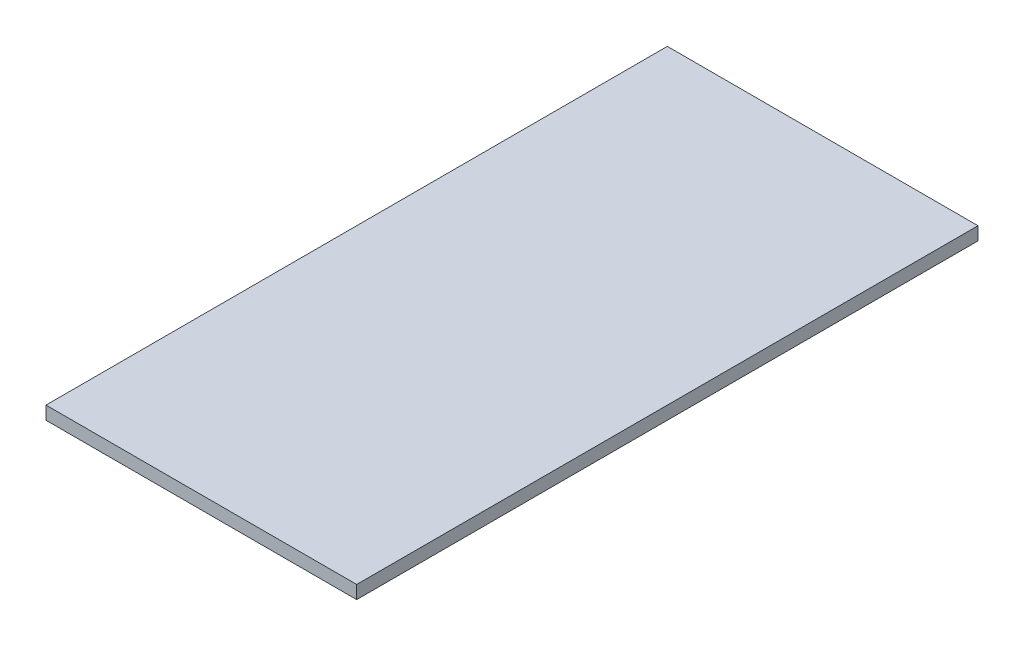
ISO-10303-21;
HEADER;
FILE_DESCRIPTION(('STEP AP214'),'2;1');
FILE_NAME('part.step','',(''),(''),'','','');
FILE_SCHEMA(('AUTOMOTIVE_DESIGN { 1 0 10303 214 1 1 1 1 }'));
ENDSEC;
DATA;
#1=APPLICATION_CONTEXT('core data for automotive mechanical design processes');
#2=APPLICATION_PROTOCOL_DEFINITION('international standard','automotive_design',2000,#1);
#3=PRODUCT_CONTEXT('',#1,'mechanical');
#4=PRODUCT('Part','Part','',(#3));
#5=PRODUCT_RELATED_PRODUCT_CATEGORY('part','',(#4));
#6=PRODUCT_DEFINITION_FORMATION('','',#4);
#7=PRODUCT_DEFINITION_CONTEXT('part definition',#1,'design');
#8=PRODUCT_DEFINITION('design','',#6,#7);
#9=PRODUCT_DEFINITION_SHAPE('','',#8);
#10=(LENGTH_UNIT() NAMED_UNIT(*) SI_UNIT(.MILLI.,.METRE.));
#11=(NAMED_UNIT(*) PLANE_ANGLE_UNIT() SI_UNIT($,.RADIAN.));
#12=(NAMED_UNIT(*) SI_UNIT($,.STERADIAN.) SOLID_ANGLE_UNIT());
#13=UNCERTAINTY_MEASURE_WITH_UNIT(LENGTH_MEASURE(1.E-05),#10,'distance_accuracy_value','');
#14=(GEOMETRIC_REPRESENTATION_CONTEXT(3) GLOBAL_UNCERTAINTY_ASSIGNED_CONTEXT((#13)) GLOBAL_UNIT_ASSIGNED_CONTEXT((#10,
#11,#12)) REPRESENTATION_CONTEXT('',''));
#15=CARTESIAN_POINT('',(0.,0.,0.));
#16=DIRECTION('',(0.,0.,1.));
#17=DIRECTION('',(1.,0.,0.));
#18=AXIS2_PLACEMENT_3D('',#15,#16,#17);
#19=CARTESIAN_POINT('',(74.9999999999999,6.35,150.));
#20=DIRECTION('',(-1.,0.,0.));
#21=DIRECTION('',(0.,0.,1.));
#22=AXIS2_PLACEMENT_3D('',#19,#20,#21);
#23=PLANE('',#22);
#24=DIRECTION('',(0.,0.,-1.));
#25=VECTOR('',#24,1.);
#26=CARTESIAN_POINT('',(74.9999999999999,0.,150.));
#27=LINE('',#26,#25);
#28=CARTESIAN_POINT('',(74.9999999999999,0.,150.));
#29=VERTEX_POINT('',#28);
#30=CARTESIAN_POINT('',(74.9999999999999,0.,-150.));
#31=VERTEX_POINT('',#30);
#32=EDGE_CURVE('E102',#29,#31,#27,.T.);
#33=ORIENTED_EDGE('',*,*,#32,.T.);
#34=DIRECTION('',(0.,-1.,0.));
#35=VECTOR('',#34,1.);
#36=CARTESIAN_POINT('',(74.9999999999999,6.35,-150.));
#37=LINE('',#36,#35);
#38=CARTESIAN_POINT('',(74.9999999999999,6.35,-150.));
#39=VERTEX_POINT('',#38);
#40=EDGE_CURVE('E11',#39,#31,#37,.T.);
#41=ORIENTED_EDGE('',*,*,#40,.F.);
#42=DIRECTION('',(0.,0.,-1.));
#43=VECTOR('',#42,1.);
#44=CARTESIAN_POINT('',(74.9999999999999,6.35,150.));
#45=LINE('',#44,#43);
#46=CARTESIAN_POINT('',(74.9999999999999,6.35,150.));
#47=VERTEX_POINT('',#46);
#48=EDGE_CURVE('E90',#47,#39,#45,.T.);
#49=ORIENTED_EDGE('',*,*,#48,.F.);
#50=DIRECTION('',(0.,-1.,0.));
#51=VECTOR('',#50,1.);
#52=CARTESIAN_POINT('',(74.9999999999999,6.35,150.));
#53=LINE('',#52,#51);
#54=EDGE_CURVE('E98',#47,#29,#53,.T.);
#55=ORIENTED_EDGE('',*,*,#54,.T.);
#56=EDGE_LOOP('',(#33,#41,#49,#55));
#57=FACE_BOUND('',#56,.T.);
#58=ADVANCED_FACE('F39',(#57),#23,.F.);
#59=CARTESIAN_POINT('',(-75.0000000000001,6.35,-150.));
#60=DIRECTION('',(0.,0.,1.));
#61=DIRECTION('',(1.,0.,0.));
#62=AXIS2_PLACEMENT_3D('',#59,#60,#61);
#63=PLANE('',#62);
#64=DIRECTION('',(-1.,0.,0.));
#65=VECTOR('',#64,1.);
#66=CARTESIAN_POINT('',(-75.0000000000001,0.,-150.));
#67=LINE('',#66,#65);
#68=CARTESIAN_POINT('',(-75.0000000000001,0.,-150.));
#69=VERTEX_POINT('',#68);
#70=EDGE_CURVE('E94',#31,#69,#67,.T.);
#71=ORIENTED_EDGE('',*,*,#70,.T.);
#72=DIRECTION('',(0.,-1.,0.));
#73=VECTOR('',#72,1.);
#74=CARTESIAN_POINT('',(-75.0000000000001,6.35,-150.));
#75=LINE('',#74,#73);
#76=CARTESIAN_POINT('',(-75.0000000000001,6.35,-150.));
#77=VERTEX_POINT('',#76);
#78=EDGE_CURVE('E47',#77,#69,#75,.T.);
#79=ORIENTED_EDGE('',*,*,#78,.F.);
#80=DIRECTION('',(-1.,0.,0.));
#81=VECTOR('',#80,1.);
#82=CARTESIAN_POINT('',(-75.0000000000001,6.35,-150.));
#83=LINE('',#82,#81);
#84=EDGE_CURVE('E85',#39,#77,#83,.T.);
#85=ORIENTED_EDGE('',*,*,#84,.F.);
#86=ORIENTED_EDGE('',*,*,#40,.T.);
#87=EDGE_LOOP('',(#71,#79,#85,#86));
#88=FACE_BOUND('',#87,.T.);
#89=ADVANCED_FACE('F93',(#88),#63,.F.);
#90=CARTESIAN_POINT('',(-75.0000000000001,6.35,150.));
#91=DIRECTION('',(1.,0.,0.));
#92=DIRECTION('',(0.,0.,-1.));
#93=AXIS2_PLACEMENT_3D('',#90,#91,#92);
#94=PLANE('',#93);
#95=DIRECTION('',(0.,0.,1.));
#96=VECTOR('',#95,1.);
#97=CARTESIAN_POINT('',(-75.0000000000001,0.,150.));
#98=LINE('',#97,#96);
#99=CARTESIAN_POINT('',(-75.0000000000001,0.,150.));
#100=VERTEX_POINT('',#99);
#101=EDGE_CURVE('E72',#69,#100,#98,.T.);
#102=ORIENTED_EDGE('',*,*,#101,.T.);
#103=DIRECTION('',(0.,-1.,0.));
#104=VECTOR('',#103,1.);
#105=CARTESIAN_POINT('',(-75.0000000000001,6.35,150.));
#106=LINE('',#105,#104);
#107=CARTESIAN_POINT('',(-75.0000000000001,6.35,150.));
#108=VERTEX_POINT('',#107);
#109=EDGE_CURVE('E95',#108,#100,#106,.T.);
#110=ORIENTED_EDGE('',*,*,#109,.F.);
#111=DIRECTION('',(0.,0.,1.));
#112=VECTOR('',#111,1.);
#113=CARTESIAN_POINT('',(-75.0000000000001,6.35,150.));
#114=LINE('',#113,#112);
#115=EDGE_CURVE('E88',#77,#108,#114,.T.);
#116=ORIENTED_EDGE('',*,*,#115,.F.);
#117=ORIENTED_EDGE('',*,*,#78,.T.);
#118=EDGE_LOOP('',(#102,#110,#116,#117));
#119=FACE_BOUND('',#118,.T.);
#120=ADVANCED_FACE('F96',(#119),#94,.F.);
#121=CARTESIAN_POINT('',(-75.0000000000001,6.35,150.));
#122=DIRECTION('',(0.,0.,-1.));
#123=DIRECTION('',(-1.,0.,0.));
#124=AXIS2_PLACEMENT_3D('',#121,#122,#123);
#125=PLANE('',#124);
#126=DIRECTION('',(1.,0.,0.));
#127=VECTOR('',#126,1.);
#128=CARTESIAN_POINT('',(-75.0000000000001,0.,150.));
#129=LINE('',#128,#127);
#130=EDGE_CURVE('E78',#100,#29,#129,.T.);
#131=ORIENTED_EDGE('',*,*,#130,.T.);
#132=ORIENTED_EDGE('',*,*,#54,.F.);
#133=DIRECTION('',(1.,0.,0.));
#134=VECTOR('',#133,1.);
#135=CARTESIAN_POINT('',(-75.0000000000001,6.35,150.));
#136=LINE('',#135,#134);
#137=EDGE_CURVE('E55',#108,#47,#136,.T.);
#138=ORIENTED_EDGE('',*,*,#137,.F.);
#139=ORIENTED_EDGE('',*,*,#109,.T.);
#140=EDGE_LOOP('',(#131,#132,#138,#139));
#141=FACE_BOUND('',#140,.T.);
#142=ADVANCED_FACE('F109',(#141),#125,.F.);
#143=CARTESIAN_POINT('',(0.,6.35,0.));
#144=DIRECTION('',(0.,-1.,0.));
#145=DIRECTION('',(0.,0.,-1.));
#146=AXIS2_PLACEMENT_3D('',#143,#144,#145);
#147=PLANE('',#146);
#148=ORIENTED_EDGE('',*,*,#48,.T.);
#149=ORIENTED_EDGE('',*,*,#84,.T.);
#150=ORIENTED_EDGE('',*,*,#115,.T.);
#151=ORIENTED_EDGE('',*,*,#137,.T.);
#152=EDGE_LOOP('',(#148,#149,#150,#151));
#153=FACE_BOUND('',#152,.T.);
#154=ADVANCED_FACE('F86',(#153),#147,.F.);
#155=CARTESIAN_POINT('',(0.,0.,0.));
#156=DIRECTION('',(0.,-1.,0.));
#157=DIRECTION('',(0.,0.,-1.));
#158=AXIS2_PLACEMENT_3D('',#155,#156,#157);
#159=PLANE('',#158);
#160=ORIENTED_EDGE('',*,*,#32,.F.);
#161=ORIENTED_EDGE('',*,*,#130,.F.);
#162=ORIENTED_EDGE('',*,*,#101,.F.);
#163=ORIENTED_EDGE('',*,*,#70,.F.);
#164=EDGE_LOOP('',(#160,#161,#162,#163));
#165=FACE_BOUND('',#164,.T.);
#166=ADVANCED_FACE('F112',(#165),#159,.T.);
#167=CLOSED_SHELL('',(#58,#89,#120,#142,#154,#166));
#168=MANIFOLD_SOLID_BREP('B2',#167);
#169=ADVANCED_BREP_SHAPE_REPRESENTATION('',(#18,#168),#14);
#170=SHAPE_DEFINITION_REPRESENTATION(#9,#169);
ENDSEC;
END-ISO-10303-21;
